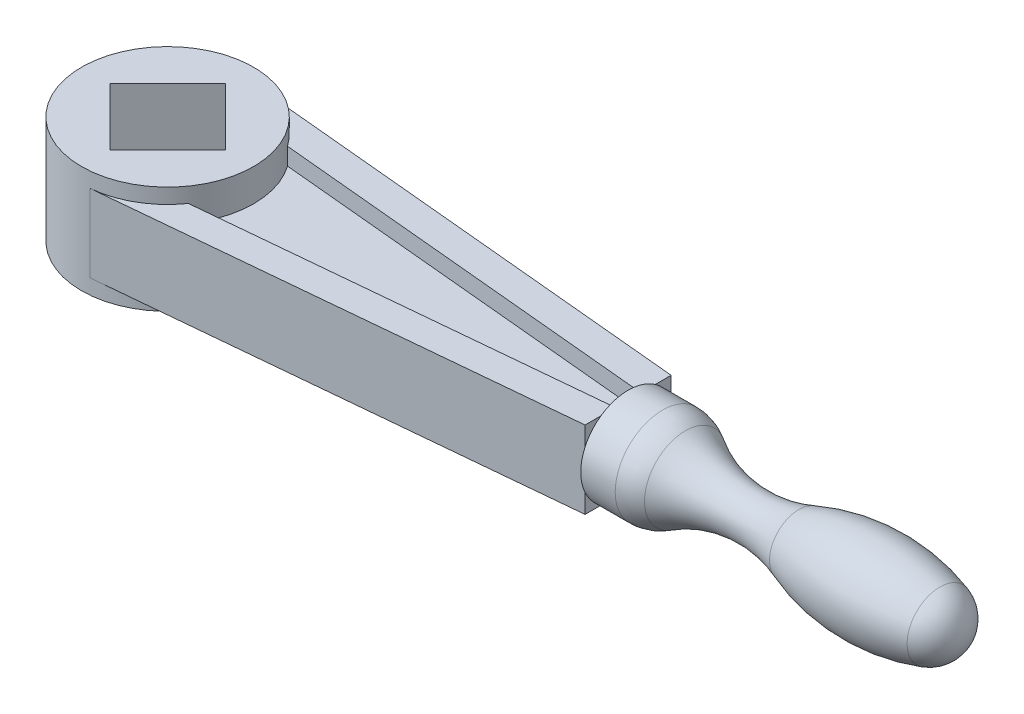
ISO-10303-21;
HEADER;
FILE_DESCRIPTION(('STEP AP214'),'2;1');
FILE_NAME('part.step','',(''),(''),'','','');
FILE_SCHEMA(('AUTOMOTIVE_DESIGN { 1 0 10303 214 1 1 1 1 }'));
ENDSEC;
DATA;
#1=APPLICATION_CONTEXT('core data for automotive mechanical design processes');
#2=APPLICATION_PROTOCOL_DEFINITION('international standard','automotive_design',2000,#1);
#3=PRODUCT_CONTEXT('',#1,'mechanical');
#4=PRODUCT('Part','Part','',(#3));
#5=PRODUCT_RELATED_PRODUCT_CATEGORY('part','',(#4));
#6=PRODUCT_DEFINITION_FORMATION('','',#4);
#7=PRODUCT_DEFINITION_CONTEXT('part definition',#1,'design');
#8=PRODUCT_DEFINITION('design','',#6,#7);
#9=PRODUCT_DEFINITION_SHAPE('','',#8);
#10=(LENGTH_UNIT() NAMED_UNIT(*) SI_UNIT(.MILLI.,.METRE.));
#11=(NAMED_UNIT(*) PLANE_ANGLE_UNIT() SI_UNIT($,.RADIAN.));
#12=(NAMED_UNIT(*) SI_UNIT($,.STERADIAN.) SOLID_ANGLE_UNIT());
#13=UNCERTAINTY_MEASURE_WITH_UNIT(LENGTH_MEASURE(1.E-05),#10,'distance_accuracy_value','');
#14=(GEOMETRIC_REPRESENTATION_CONTEXT(3) GLOBAL_UNCERTAINTY_ASSIGNED_CONTEXT((#13)) GLOBAL_UNIT_ASSIGNED_CONTEXT((#10,
#11,#12)) REPRESENTATION_CONTEXT('',''));
#15=CARTESIAN_POINT('',(0.,0.,0.));
#16=DIRECTION('',(0.,0.,1.));
#17=DIRECTION('',(1.,0.,0.));
#18=AXIS2_PLACEMENT_3D('',#15,#16,#17);
#19=CARTESIAN_POINT('',(107.,9.,0.));
#20=DIRECTION('',(-1.,0.,0.));
#21=DIRECTION('',(0.,0.,1.));
#22=AXIS2_PLACEMENT_3D('',#19,#20,#21);
#23=PLANE('',#22);
#24=DIRECTION('',(0.,-1.,0.));
#25=VECTOR('',#24,1.);
#26=CARTESIAN_POINT('',(107.,9.,10.));
#27=LINE('',#26,#25);
#28=CARTESIAN_POINT('',(107.,9.,10.));
#29=VERTEX_POINT('',#28);
#30=CARTESIAN_POINT('',(107.,4.58257569495584,10.));
#31=VERTEX_POINT('',#30);
#32=EDGE_CURVE('E215',#29,#31,#27,.T.);
#33=ORIENTED_EDGE('',*,*,#32,.T.);
#34=CARTESIAN_POINT('',(107.,0.,0.));
#35=DIRECTION('',(-1.,0.,0.));
#36=DIRECTION('',(0.,0.,1.));
#37=AXIS2_PLACEMENT_3D('',#34,#35,#36);
#38=CIRCLE('',#37,11.);
#39=CARTESIAN_POINT('',(107.,9.,6.32455532033676));
#40=VERTEX_POINT('',#39);
#41=EDGE_CURVE('E195',#31,#40,#38,.T.);
#42=ORIENTED_EDGE('',*,*,#41,.T.);
#43=DIRECTION('',(0.,0.,-1.));
#44=VECTOR('',#43,1.);
#45=CARTESIAN_POINT('',(107.,9.,0.));
#46=LINE('',#45,#44);
#47=EDGE_CURVE('E216',#29,#40,#46,.T.);
#48=ORIENTED_EDGE('',*,*,#47,.F.);
#49=EDGE_LOOP('',(#33,#42,#48));
#50=FACE_BOUND('',#49,.T.);
#51=ADVANCED_FACE('F50',(#50),#23,.F.);
#52=CARTESIAN_POINT('',(107.,9.,-6.32455532033676));
#53=VERTEX_POINT('',#52);
#54=CARTESIAN_POINT('',(107.,9.,-10.));
#55=VERTEX_POINT('',#54);
#56=EDGE_CURVE('E279',#53,#55,#46,.T.);
#57=ORIENTED_EDGE('',*,*,#56,.F.);
#58=CARTESIAN_POINT('',(107.,4.58257569495584,-10.));
#59=VERTEX_POINT('',#58);
#60=EDGE_CURVE('E11',#53,#59,#38,.T.);
#61=ORIENTED_EDGE('',*,*,#60,.T.);
#62=DIRECTION('',(0.,-1.,0.));
#63=VECTOR('',#62,1.);
#64=CARTESIAN_POINT('',(107.,9.,-10.));
#65=LINE('',#64,#63);
#66=EDGE_CURVE('E221',#55,#59,#65,.T.);
#67=ORIENTED_EDGE('',*,*,#66,.F.);
#68=EDGE_LOOP('',(#57,#61,#67));
#69=FACE_BOUND('',#68,.T.);
#70=ADVANCED_FACE('F379',(#69),#23,.F.);
#71=CARTESIAN_POINT('',(107.,-4.58257569495584,-10.));
#72=VERTEX_POINT('',#71);
#73=CARTESIAN_POINT('',(107.,-9.,-10.));
#74=VERTEX_POINT('',#73);
#75=EDGE_CURVE('E233',#72,#74,#65,.T.);
#76=ORIENTED_EDGE('',*,*,#75,.F.);
#77=CARTESIAN_POINT('',(107.,-9.,-6.32455532033676));
#78=VERTEX_POINT('',#77);
#79=EDGE_CURVE('E60',#72,#78,#38,.T.);
#80=ORIENTED_EDGE('',*,*,#79,.T.);
#81=DIRECTION('',(0.,0.,-1.));
#82=VECTOR('',#81,1.);
#83=CARTESIAN_POINT('',(107.,-9.,0.));
#84=LINE('',#83,#82);
#85=EDGE_CURVE('E264',#78,#74,#84,.T.);
#86=ORIENTED_EDGE('',*,*,#85,.T.);
#87=EDGE_LOOP('',(#76,#80,#86));
#88=FACE_BOUND('',#87,.T.);
#89=ADVANCED_FACE('F390',(#88),#23,.F.);
#90=CARTESIAN_POINT('',(0.,-9.,0.));
#91=DIRECTION('',(0.,1.,0.));
#92=DIRECTION('',(0.,0.,1.));
#93=AXIS2_PLACEMENT_3D('',#90,#91,#92);
#94=PLANE('',#93);
#95=CARTESIAN_POINT('',(0.,-9.,0.));
#96=DIRECTION('',(0.,1.,0.));
#97=DIRECTION('',(0.,0.,1.));
#98=AXIS2_PLACEMENT_3D('',#95,#96,#97);
#99=CIRCLE('',#98,20.);
#100=CARTESIAN_POINT('',(1.87741232719192,-9.,19.9116880990464));
#101=VERTEX_POINT('',#100);
#102=CARTESIAN_POINT('',(16.3518909317657,-9.,11.5158874150297));
#103=VERTEX_POINT('',#102);
#104=EDGE_CURVE('E266',#101,#103,#99,.T.);
#105=ORIENTED_EDGE('',*,*,#104,.T.);
#106=DIRECTION('',(0.995584404952322,0.,-0.0938706163595961));
#107=VECTOR('',#106,1.);
#108=CARTESIAN_POINT('',(107.,-9.,2.9689537469852));
#109=LINE('',#108,#107);
#110=CARTESIAN_POINT('',(107.,-9.,2.9689537469852));
#111=VERTEX_POINT('',#110);
#112=EDGE_CURVE('E334',#103,#111,#109,.T.);
#113=ORIENTED_EDGE('',*,*,#112,.T.);
#114=CARTESIAN_POINT('',(107.,-9.,6.32455532033676));
#115=VERTEX_POINT('',#114);
#116=EDGE_CURVE('E259',#115,#111,#84,.T.);
#117=ORIENTED_EDGE('',*,*,#116,.F.);
#118=CARTESIAN_POINT('',(107.,-9.,10.));
#119=VERTEX_POINT('',#118);
#120=EDGE_CURVE('E258',#119,#115,#84,.T.);
#121=ORIENTED_EDGE('',*,*,#120,.F.);
#122=DIRECTION('',(-0.995584404952322,0.,0.0938706163595961));
#123=VECTOR('',#122,1.);
#124=CARTESIAN_POINT('',(1.87741232719192,-9.,19.9116880990465));
#125=LINE('',#124,#123);
#126=EDGE_CURVE('E261',#119,#101,#125,.T.);
#127=ORIENTED_EDGE('',*,*,#126,.T.);
#128=EDGE_LOOP('',(#105,#113,#117,#121,#127));
#129=FACE_BOUND('',#128,.T.);
#130=ADVANCED_FACE('F396',(#129),#94,.F.);
#131=CARTESIAN_POINT('',(0.,9.,0.));
#132=DIRECTION('',(0.,1.,0.));
#133=DIRECTION('',(0.,0.,1.));
#134=AXIS2_PLACEMENT_3D('',#131,#132,#133);
#135=PLANE('',#134);
#136=DIRECTION('',(-0.995584404952322,0.,-0.0938706163595961));
#137=VECTOR('',#136,1.);
#138=CARTESIAN_POINT('',(107.,9.,-2.96895374698519));
#139=LINE('',#138,#137);
#140=CARTESIAN_POINT('',(107.,9.,-2.96895374698519));
#141=VERTEX_POINT('',#140);
#142=CARTESIAN_POINT('',(16.3518909317657,9.,-11.5158874150297));
#143=VERTEX_POINT('',#142);
#144=EDGE_CURVE('E303',#141,#143,#139,.T.);
#145=ORIENTED_EDGE('',*,*,#144,.F.);
#146=EDGE_CURVE('E273',#141,#53,#46,.T.);
#147=ORIENTED_EDGE('',*,*,#146,.T.);
#148=ORIENTED_EDGE('',*,*,#56,.T.);
#149=DIRECTION('',(-0.995584404952322,0.,-0.0938706163595961));
#150=VECTOR('',#149,1.);
#151=CARTESIAN_POINT('',(1.87741232719192,9.,-19.9116880990465));
#152=LINE('',#151,#150);
#153=CARTESIAN_POINT('',(1.87741232719192,9.,-19.9116880990465));
#154=VERTEX_POINT('',#153);
#155=EDGE_CURVE('E244',#55,#154,#152,.T.);
#156=ORIENTED_EDGE('',*,*,#155,.T.);
#157=CARTESIAN_POINT('',(0.,9.,0.));
#158=DIRECTION('',(0.,1.,0.));
#159=DIRECTION('',(0.,0.,1.));
#160=AXIS2_PLACEMENT_3D('',#157,#158,#159);
#161=CIRCLE('',#160,20.);
#162=EDGE_CURVE('E254',#143,#154,#161,.T.);
#163=ORIENTED_EDGE('',*,*,#162,.F.);
#164=EDGE_LOOP('',(#145,#147,#148,#156,#163));
#165=FACE_BOUND('',#164,.T.);
#166=ADVANCED_FACE('F403',(#165),#135,.T.);
#167=DIRECTION('',(0.995584404952322,0.,-0.0938706163595961));
#168=VECTOR('',#167,1.);
#169=CARTESIAN_POINT('',(107.,9.,2.9689537469852));
#170=LINE('',#169,#168);
#171=CARTESIAN_POINT('',(16.3518909317657,9.,11.5158874150297));
#172=VERTEX_POINT('',#171);
#173=CARTESIAN_POINT('',(107.,9.,2.9689537469852));
#174=VERTEX_POINT('',#173);
#175=EDGE_CURVE('E298',#172,#174,#170,.T.);
#176=ORIENTED_EDGE('',*,*,#175,.F.);
#177=CARTESIAN_POINT('',(1.87741232719192,9.,19.9116880990465));
#178=VERTEX_POINT('',#177);
#179=EDGE_CURVE('E276',#178,#172,#161,.T.);
#180=ORIENTED_EDGE('',*,*,#179,.F.);
#181=DIRECTION('',(-0.995584404952322,0.,0.0938706163595961));
#182=VECTOR('',#181,1.);
#183=CARTESIAN_POINT('',(1.87741232719192,9.,19.9116880990465));
#184=LINE('',#183,#182);
#185=EDGE_CURVE('E274',#29,#178,#184,.T.);
#186=ORIENTED_EDGE('',*,*,#185,.F.);
#187=ORIENTED_EDGE('',*,*,#47,.T.);
#188=EDGE_CURVE('E272',#40,#174,#46,.T.);
#189=ORIENTED_EDGE('',*,*,#188,.T.);
#190=EDGE_LOOP('',(#176,#180,#186,#187,#189));
#191=FACE_BOUND('',#190,.T.);
#192=ADVANCED_FACE('F429',(#191),#135,.T.);
#193=CARTESIAN_POINT('',(0.,12.5,0.));
#194=DIRECTION('',(0.,-1.,0.));
#195=DIRECTION('',(0.,0.,-1.));
#196=AXIS2_PLACEMENT_3D('',#193,#194,#195);
#197=CYLINDRICAL_SURFACE('',#196,20.);
#198=CARTESIAN_POINT('',(0.,-12.5,0.));
#199=DIRECTION('',(0.,1.,0.));
#200=DIRECTION('',(0.,0.,1.));
#201=AXIS2_PLACEMENT_3D('',#198,#199,#200);
#202=CIRCLE('',#201,20.);
#203=CARTESIAN_POINT('',(0.,-12.5,20.));
#204=VERTEX_POINT('',#203);
#205=EDGE_CURVE('E51',#204,#204,#202,.T.);
#206=ORIENTED_EDGE('',*,*,#205,.T.);
#207=EDGE_LOOP('',(#206));
#208=FACE_BOUND('',#207,.T.);
#209=CARTESIAN_POINT('',(0.,12.5,0.));
#210=DIRECTION('',(0.,1.,0.));
#211=DIRECTION('',(0.,0.,1.));
#212=AXIS2_PLACEMENT_3D('',#209,#210,#211);
#213=CIRCLE('',#212,20.);
#214=CARTESIAN_POINT('',(0.,12.5,20.));
#215=VERTEX_POINT('',#214);
#216=EDGE_CURVE('E457',#215,#215,#213,.T.);
#217=ORIENTED_EDGE('',*,*,#216,.F.);
#218=EDGE_LOOP('',(#217));
#219=FACE_BOUND('',#218,.T.);
#220=DIRECTION('',(0.,-1.,0.));
#221=VECTOR('',#220,1.);
#222=CARTESIAN_POINT('',(1.87741232719192,9.,19.9116880990465));
#223=LINE('',#222,#221);
#224=EDGE_CURVE('E74',#178,#101,#223,.T.);
#225=ORIENTED_EDGE('',*,*,#224,.F.);
#226=ORIENTED_EDGE('',*,*,#179,.T.);
#227=DIRECTION('',(0.,1.,0.));
#228=VECTOR('',#227,1.);
#229=CARTESIAN_POINT('',(16.3518909317657,5.,11.5158874150297));
#230=LINE('',#229,#228);
#231=CARTESIAN_POINT('',(16.3518909317657,5.,11.5158874150297));
#232=VERTEX_POINT('',#231);
#233=EDGE_CURVE('E286',#232,#172,#230,.T.);
#234=ORIENTED_EDGE('',*,*,#233,.F.);
#235=CARTESIAN_POINT('',(0.,5.,0.));
#236=DIRECTION('',(0.,-1.,0.));
#237=DIRECTION('',(0.,0.,1.));
#238=AXIS2_PLACEMENT_3D('',#235,#236,#237);
#239=CIRCLE('',#238,20.);
#240=CARTESIAN_POINT('',(16.3518909317657,5.,-11.5158874150297));
#241=VERTEX_POINT('',#240);
#242=EDGE_CURVE('E310',#241,#232,#239,.T.);
#243=ORIENTED_EDGE('',*,*,#242,.F.);
#244=DIRECTION('',(0.,1.,0.));
#245=VECTOR('',#244,1.);
#246=CARTESIAN_POINT('',(16.3518909317657,5.,-11.5158874150297));
#247=LINE('',#246,#245);
#248=EDGE_CURVE('E288',#241,#143,#247,.T.);
#249=ORIENTED_EDGE('',*,*,#248,.T.);
#250=ORIENTED_EDGE('',*,*,#162,.T.);
#251=DIRECTION('',(0.,-1.,0.));
#252=VECTOR('',#251,1.);
#253=CARTESIAN_POINT('',(1.87741232719192,9.,-19.9116880990465));
#254=LINE('',#253,#252);
#255=CARTESIAN_POINT('',(1.87741232719192,-9.,-19.9116880990465));
#256=VERTEX_POINT('',#255);
#257=EDGE_CURVE('E239',#154,#256,#254,.T.);
#258=ORIENTED_EDGE('',*,*,#257,.T.);
#259=CARTESIAN_POINT('',(16.3518909317657,-9.,-11.5158874150297));
#260=VERTEX_POINT('',#259);
#261=EDGE_CURVE('E267',#260,#256,#99,.T.);
#262=ORIENTED_EDGE('',*,*,#261,.F.);
#263=DIRECTION('',(0.,-1.,0.));
#264=VECTOR('',#263,1.);
#265=CARTESIAN_POINT('',(16.3518909317657,-5.,-11.5158874150297));
#266=LINE('',#265,#264);
#267=CARTESIAN_POINT('',(16.3518909317657,-5.,-11.5158874150297));
#268=VERTEX_POINT('',#267);
#269=EDGE_CURVE('E325',#268,#260,#266,.T.);
#270=ORIENTED_EDGE('',*,*,#269,.F.);
#271=CARTESIAN_POINT('',(0.,-5.,0.));
#272=DIRECTION('',(0.,-1.,0.));
#273=DIRECTION('',(0.,0.,1.));
#274=AXIS2_PLACEMENT_3D('',#271,#272,#273);
#275=CIRCLE('',#274,20.);
#276=CARTESIAN_POINT('',(16.3518909317657,-5.,11.5158874150297));
#277=VERTEX_POINT('',#276);
#278=EDGE_CURVE('E345',#268,#277,#275,.T.);
#279=ORIENTED_EDGE('',*,*,#278,.T.);
#280=DIRECTION('',(0.,-1.,0.));
#281=VECTOR('',#280,1.);
#282=CARTESIAN_POINT('',(16.3518909317657,-5.,11.5158874150297));
#283=LINE('',#282,#281);
#284=EDGE_CURVE('E324',#277,#103,#283,.T.);
#285=ORIENTED_EDGE('',*,*,#284,.T.);
#286=ORIENTED_EDGE('',*,*,#104,.F.);
#287=EDGE_LOOP('',(#225,#226,#234,#243,#249,#250,#258,#262,#270,#279,#285,#286));
#288=FACE_BOUND('',#287,.T.);
#289=ADVANCED_FACE('F47',(#208,#219,#288),#197,.T.);
#290=CARTESIAN_POINT('',(0.,12.5,0.));
#291=DIRECTION('',(0.,1.,0.));
#292=DIRECTION('',(0.,0.,1.));
#293=AXIS2_PLACEMENT_3D('',#290,#291,#292);
#294=PLANE('',#293);
#295=ORIENTED_EDGE('',*,*,#216,.T.);
#296=EDGE_LOOP('',(#295));
#297=FACE_BOUND('',#296,.T.);
#298=DIRECTION('',(-0.707106781186548,0.,-0.707106781186548));
#299=VECTOR('',#298,1.);
#300=CARTESIAN_POINT('',(0.,12.5,-13.4350288425444));
#301=LINE('',#300,#299);
#302=CARTESIAN_POINT('',(13.4350288425444,12.5,0.));
#303=VERTEX_POINT('',#302);
#304=CARTESIAN_POINT('',(0.,12.5,-13.4350288425444));
#305=VERTEX_POINT('',#304);
#306=EDGE_CURVE('E505',#303,#305,#301,.T.);
#307=ORIENTED_EDGE('',*,*,#306,.F.);
#308=DIRECTION('',(0.707106781186548,0.,-0.707106781186547));
#309=VECTOR('',#308,1.);
#310=CARTESIAN_POINT('',(13.4350288425444,12.5,0.));
#311=LINE('',#310,#309);
#312=CARTESIAN_POINT('',(0.,12.5,13.4350288425444));
#313=VERTEX_POINT('',#312);
#314=EDGE_CURVE('E482',#313,#303,#311,.T.);
#315=ORIENTED_EDGE('',*,*,#314,.F.);
#316=DIRECTION('',(0.707106781186548,0.,0.707106781186547));
#317=VECTOR('',#316,1.);
#318=CARTESIAN_POINT('',(-13.4350288425444,12.5,0.));
#319=LINE('',#318,#317);
#320=CARTESIAN_POINT('',(-13.4350288425444,12.5,0.));
#321=VERTEX_POINT('',#320);
#322=EDGE_CURVE('E479',#321,#313,#319,.T.);
#323=ORIENTED_EDGE('',*,*,#322,.F.);
#324=DIRECTION('',(-0.707106781186548,0.,0.707106781186548));
#325=VECTOR('',#324,1.);
#326=CARTESIAN_POINT('',(0.,12.5,-13.4350288425444));
#327=LINE('',#326,#325);
#328=EDGE_CURVE('E499',#305,#321,#327,.T.);
#329=ORIENTED_EDGE('',*,*,#328,.F.);
#330=EDGE_LOOP('',(#307,#315,#323,#329));
#331=FACE_BOUND('',#330,.T.);
#332=ADVANCED_FACE('F516',(#297,#331),#294,.T.);
#333=CARTESIAN_POINT('',(0.,-12.5,0.));
#334=DIRECTION('',(0.,1.,0.));
#335=DIRECTION('',(0.,0.,1.));
#336=AXIS2_PLACEMENT_3D('',#333,#334,#335);
#337=PLANE('',#336);
#338=ORIENTED_EDGE('',*,*,#205,.F.);
#339=EDGE_LOOP('',(#338));
#340=FACE_BOUND('',#339,.T.);
#341=DIRECTION('',(0.707106781186548,0.,-0.707106781186547));
#342=VECTOR('',#341,1.);
#343=CARTESIAN_POINT('',(13.4350288425444,-12.5,0.));
#344=LINE('',#343,#342);
#345=CARTESIAN_POINT('',(0.,-12.5,13.4350288425444));
#346=VERTEX_POINT('',#345);
#347=CARTESIAN_POINT('',(13.4350288425444,-12.5,0.));
#348=VERTEX_POINT('',#347);
#349=EDGE_CURVE('E219',#346,#348,#344,.T.);
#350=ORIENTED_EDGE('',*,*,#349,.T.);
#351=DIRECTION('',(-0.707106781186548,0.,-0.707106781186548));
#352=VECTOR('',#351,1.);
#353=CARTESIAN_POINT('',(0.,-12.5,-13.4350288425444));
#354=LINE('',#353,#352);
#355=CARTESIAN_POINT('',(0.,-12.5,-13.4350288425444));
#356=VERTEX_POINT('',#355);
#357=EDGE_CURVE('E487',#348,#356,#354,.T.);
#358=ORIENTED_EDGE('',*,*,#357,.T.);
#359=DIRECTION('',(-0.707106781186548,0.,0.707106781186548));
#360=VECTOR('',#359,1.);
#361=CARTESIAN_POINT('',(0.,-12.5,-13.4350288425444));
#362=LINE('',#361,#360);
#363=CARTESIAN_POINT('',(-13.4350288425444,-12.5,0.));
#364=VERTEX_POINT('',#363);
#365=EDGE_CURVE('E484',#356,#364,#362,.T.);
#366=ORIENTED_EDGE('',*,*,#365,.T.);
#367=DIRECTION('',(0.707106781186548,0.,0.707106781186547));
#368=VECTOR('',#367,1.);
#369=CARTESIAN_POINT('',(-13.4350288425444,-12.5,0.));
#370=LINE('',#369,#368);
#371=EDGE_CURVE('E477',#364,#346,#370,.T.);
#372=ORIENTED_EDGE('',*,*,#371,.T.);
#373=EDGE_LOOP('',(#350,#358,#366,#372));
#374=FACE_BOUND('',#373,.T.);
#375=ADVANCED_FACE('F525',(#340,#374),#337,.F.);
#376=CARTESIAN_POINT('',(13.4350288425444,12.5,0.));
#377=DIRECTION('',(-0.707106781186547,0.,-0.707106781186548));
#378=DIRECTION('',(-0.707106781186548,0.,0.707106781186547));
#379=AXIS2_PLACEMENT_3D('',#376,#377,#378);
#380=PLANE('',#379);
#381=ORIENTED_EDGE('',*,*,#349,.F.);
#382=DIRECTION('',(0.,-1.,0.));
#383=VECTOR('',#382,1.);
#384=CARTESIAN_POINT('',(0.,12.5,13.4350288425444));
#385=LINE('',#384,#383);
#386=EDGE_CURVE('E474',#313,#346,#385,.T.);
#387=ORIENTED_EDGE('',*,*,#386,.F.);
#388=ORIENTED_EDGE('',*,*,#314,.T.);
#389=DIRECTION('',(0.,-1.,0.));
#390=VECTOR('',#389,1.);
#391=CARTESIAN_POINT('',(13.4350288425444,12.5,0.));
#392=LINE('',#391,#390);
#393=EDGE_CURVE('E462',#303,#348,#392,.T.);
#394=ORIENTED_EDGE('',*,*,#393,.T.);
#395=EDGE_LOOP('',(#381,#387,#388,#394));
#396=FACE_BOUND('',#395,.T.);
#397=ADVANCED_FACE('F506',(#396),#380,.T.);
#398=CARTESIAN_POINT('',(0.,12.5,-13.4350288425444));
#399=DIRECTION('',(-0.707106781186548,0.,0.707106781186548));
#400=DIRECTION('',(0.707106781186548,0.,0.707106781186548));
#401=AXIS2_PLACEMENT_3D('',#398,#399,#400);
#402=PLANE('',#401);
#403=ORIENTED_EDGE('',*,*,#357,.F.);
#404=ORIENTED_EDGE('',*,*,#393,.F.);
#405=ORIENTED_EDGE('',*,*,#306,.T.);
#406=DIRECTION('',(0.,-1.,0.));
#407=VECTOR('',#406,1.);
#408=CARTESIAN_POINT('',(0.,12.5,-13.4350288425444));
#409=LINE('',#408,#407);
#410=EDGE_CURVE('E470',#305,#356,#409,.T.);
#411=ORIENTED_EDGE('',*,*,#410,.T.);
#412=EDGE_LOOP('',(#403,#404,#405,#411));
#413=FACE_BOUND('',#412,.T.);
#414=ADVANCED_FACE('F513',(#413),#402,.T.);
#415=CARTESIAN_POINT('',(0.,12.5,-13.4350288425444));
#416=DIRECTION('',(0.707106781186548,0.,0.707106781186548));
#417=DIRECTION('',(0.707106781186548,0.,-0.707106781186548));
#418=AXIS2_PLACEMENT_3D('',#415,#416,#417);
#419=PLANE('',#418);
#420=ORIENTED_EDGE('',*,*,#365,.F.);
#421=ORIENTED_EDGE('',*,*,#410,.F.);
#422=ORIENTED_EDGE('',*,*,#328,.T.);
#423=DIRECTION('',(0.,-1.,0.));
#424=VECTOR('',#423,1.);
#425=CARTESIAN_POINT('',(-13.4350288425444,12.5,0.));
#426=LINE('',#425,#424);
#427=EDGE_CURVE('E472',#321,#364,#426,.T.);
#428=ORIENTED_EDGE('',*,*,#427,.T.);
#429=EDGE_LOOP('',(#420,#421,#422,#428));
#430=FACE_BOUND('',#429,.T.);
#431=ADVANCED_FACE('F523',(#430),#419,.T.);
#432=CARTESIAN_POINT('',(-13.4350288425444,12.5,0.));
#433=DIRECTION('',(0.707106781186547,0.,-0.707106781186548));
#434=DIRECTION('',(-0.707106781186548,0.,-0.707106781186547));
#435=AXIS2_PLACEMENT_3D('',#432,#433,#434);
#436=PLANE('',#435);
#437=ORIENTED_EDGE('',*,*,#371,.F.);
#438=ORIENTED_EDGE('',*,*,#427,.F.);
#439=ORIENTED_EDGE('',*,*,#322,.T.);
#440=ORIENTED_EDGE('',*,*,#386,.T.);
#441=EDGE_LOOP('',(#437,#438,#439,#440));
#442=FACE_BOUND('',#441,.T.);
#443=ADVANCED_FACE('F397',(#442),#436,.T.);
#444=CARTESIAN_POINT('',(1.87741232719192,9.,19.9116880990465));
#445=DIRECTION('',(0.0938706163595961,0.,0.995584404952322));
#446=DIRECTION('',(0.995584404952322,0.,-0.0938706163595961));
#447=AXIS2_PLACEMENT_3D('',#444,#445,#446);
#448=PLANE('',#447);
#449=ORIENTED_EDGE('',*,*,#126,.F.);
#450=CARTESIAN_POINT('',(107.,-4.58257569495584,10.));
#451=VERTEX_POINT('',#450);
#452=EDGE_CURVE('E213',#451,#119,#27,.T.);
#453=ORIENTED_EDGE('',*,*,#452,.F.);
#454=EDGE_CURVE('E187',#31,#451,#27,.T.);
#455=ORIENTED_EDGE('',*,*,#454,.F.);
#456=ORIENTED_EDGE('',*,*,#32,.F.);
#457=ORIENTED_EDGE('',*,*,#185,.T.);
#458=ORIENTED_EDGE('',*,*,#224,.T.);
#459=EDGE_LOOP('',(#449,#453,#455,#456,#457,#458));
#460=FACE_BOUND('',#459,.T.);
#461=ADVANCED_FACE('F209',(#460),#448,.T.);
#462=ORIENTED_EDGE('',*,*,#120,.T.);
#463=EDGE_CURVE('E206',#115,#451,#38,.T.);
#464=ORIENTED_EDGE('',*,*,#463,.T.);
#465=ORIENTED_EDGE('',*,*,#452,.T.);
#466=EDGE_LOOP('',(#462,#464,#465));
#467=FACE_BOUND('',#466,.T.);
#468=ADVANCED_FACE('F385',(#467),#23,.F.);
#469=CARTESIAN_POINT('',(1.87741232719192,9.,-19.9116880990465));
#470=DIRECTION('',(-0.0938706163595961,0.,0.995584404952322));
#471=DIRECTION('',(0.995584404952322,0.,0.0938706163595961));
#472=AXIS2_PLACEMENT_3D('',#469,#470,#471);
#473=PLANE('',#472);
#474=DIRECTION('',(-0.995584404952322,0.,-0.0938706163595961));
#475=VECTOR('',#474,1.);
#476=CARTESIAN_POINT('',(1.87741232719192,-9.,-19.9116880990465));
#477=LINE('',#476,#475);
#478=EDGE_CURVE('E252',#74,#256,#477,.T.);
#479=ORIENTED_EDGE('',*,*,#478,.T.);
#480=ORIENTED_EDGE('',*,*,#257,.F.);
#481=ORIENTED_EDGE('',*,*,#155,.F.);
#482=ORIENTED_EDGE('',*,*,#66,.T.);
#483=EDGE_CURVE('E229',#59,#72,#65,.T.);
#484=ORIENTED_EDGE('',*,*,#483,.T.);
#485=ORIENTED_EDGE('',*,*,#75,.T.);
#486=EDGE_LOOP('',(#479,#480,#481,#482,#484,#485));
#487=FACE_BOUND('',#486,.T.);
#488=ADVANCED_FACE('F395',(#487),#473,.F.);
#489=CARTESIAN_POINT('',(107.,-9.,-2.96895374698519));
#490=VERTEX_POINT('',#489);
#491=EDGE_CURVE('E257',#490,#78,#84,.T.);
#492=ORIENTED_EDGE('',*,*,#491,.F.);
#493=DIRECTION('',(-0.995584404952322,0.,-0.0938706163595961));
#494=VECTOR('',#493,1.);
#495=CARTESIAN_POINT('',(107.,-9.,-2.96895374698519));
#496=LINE('',#495,#494);
#497=EDGE_CURVE('E202',#490,#260,#496,.T.);
#498=ORIENTED_EDGE('',*,*,#497,.T.);
#499=ORIENTED_EDGE('',*,*,#261,.T.);
#500=ORIENTED_EDGE('',*,*,#478,.F.);
#501=ORIENTED_EDGE('',*,*,#85,.F.);
#502=EDGE_LOOP('',(#492,#498,#499,#500,#501));
#503=FACE_BOUND('',#502,.T.);
#504=ADVANCED_FACE('F399',(#503),#94,.F.);
#505=CARTESIAN_POINT('',(107.,5.,2.9689537469852));
#506=DIRECTION('',(0.0938706163595961,0.,0.995584404952322));
#507=DIRECTION('',(0.995584404952322,0.,-0.0938706163595961));
#508=AXIS2_PLACEMENT_3D('',#505,#506,#507);
#509=PLANE('',#508);
#510=ORIENTED_EDGE('',*,*,#175,.T.);
#511=DIRECTION('',(0.,1.,0.));
#512=VECTOR('',#511,1.);
#513=CARTESIAN_POINT('',(107.,5.,2.9689537469852));
#514=LINE('',#513,#512);
#515=CARTESIAN_POINT('',(107.,5.,2.9689537469852));
#516=VERTEX_POINT('',#515);
#517=EDGE_CURVE('E291',#516,#174,#514,.T.);
#518=ORIENTED_EDGE('',*,*,#517,.F.);
#519=DIRECTION('',(0.995584404952322,0.,-0.0938706163595961));
#520=VECTOR('',#519,1.);
#521=CARTESIAN_POINT('',(107.,5.,2.9689537469852));
#522=LINE('',#521,#520);
#523=EDGE_CURVE('E289',#232,#516,#522,.T.);
#524=ORIENTED_EDGE('',*,*,#523,.F.);
#525=ORIENTED_EDGE('',*,*,#233,.T.);
#526=EDGE_LOOP('',(#510,#518,#524,#525));
#527=FACE_BOUND('',#526,.T.);
#528=ADVANCED_FACE('F433',(#527),#509,.F.);
#529=CARTESIAN_POINT('',(107.,5.,-2.96895374698519));
#530=DIRECTION('',(0.0938706163595961,0.,-0.995584404952322));
#531=DIRECTION('',(-0.995584404952322,0.,-0.0938706163595961));
#532=AXIS2_PLACEMENT_3D('',#529,#530,#531);
#533=PLANE('',#532);
#534=ORIENTED_EDGE('',*,*,#144,.T.);
#535=ORIENTED_EDGE('',*,*,#248,.F.);
#536=DIRECTION('',(-0.995584404952322,0.,-0.0938706163595961));
#537=VECTOR('',#536,1.);
#538=CARTESIAN_POINT('',(107.,5.,-2.96895374698519));
#539=LINE('',#538,#537);
#540=CARTESIAN_POINT('',(107.,5.,-2.96895374698519));
#541=VERTEX_POINT('',#540);
#542=EDGE_CURVE('E311',#541,#241,#539,.T.);
#543=ORIENTED_EDGE('',*,*,#542,.F.);
#544=DIRECTION('',(0.,1.,0.));
#545=VECTOR('',#544,1.);
#546=CARTESIAN_POINT('',(107.,5.,-2.96895374698519));
#547=LINE('',#546,#545);
#548=EDGE_CURVE('E285',#541,#141,#547,.T.);
#549=ORIENTED_EDGE('',*,*,#548,.T.);
#550=EDGE_LOOP('',(#534,#535,#543,#549));
#551=FACE_BOUND('',#550,.T.);
#552=ADVANCED_FACE('F439',(#551),#533,.F.);
#553=CARTESIAN_POINT('',(0.,5.,0.));
#554=DIRECTION('',(0.,1.,0.));
#555=DIRECTION('',(0.,0.,1.));
#556=AXIS2_PLACEMENT_3D('',#553,#554,#555);
#557=PLANE('',#556);
#558=DIRECTION('',(0.,0.,-1.));
#559=VECTOR('',#558,1.);
#560=CARTESIAN_POINT('',(107.,5.,2.9689537469852));
#561=LINE('',#560,#559);
#562=EDGE_CURVE('E299',#516,#541,#561,.T.);
#563=ORIENTED_EDGE('',*,*,#562,.T.);
#564=ORIENTED_EDGE('',*,*,#542,.T.);
#565=ORIENTED_EDGE('',*,*,#242,.T.);
#566=ORIENTED_EDGE('',*,*,#523,.T.);
#567=EDGE_LOOP('',(#563,#564,#565,#566));
#568=FACE_BOUND('',#567,.T.);
#569=ADVANCED_FACE('F440',(#568),#557,.T.);
#570=CARTESIAN_POINT('',(107.,-5.,-2.96895374698519));
#571=DIRECTION('',(-0.0938706163595961,0.,0.995584404952322));
#572=DIRECTION('',(0.995584404952322,0.,0.0938706163595961));
#573=AXIS2_PLACEMENT_3D('',#570,#571,#572);
#574=PLANE('',#573);
#575=ORIENTED_EDGE('',*,*,#497,.F.);
#576=DIRECTION('',(0.,-1.,0.));
#577=VECTOR('',#576,1.);
#578=CARTESIAN_POINT('',(107.,-5.,-2.96895374698519));
#579=LINE('',#578,#577);
#580=CARTESIAN_POINT('',(107.,-5.,-2.96895374698519));
#581=VERTEX_POINT('',#580);
#582=EDGE_CURVE('E301',#581,#490,#579,.T.);
#583=ORIENTED_EDGE('',*,*,#582,.F.);
#584=DIRECTION('',(-0.995584404952322,0.,-0.0938706163595961));
#585=VECTOR('',#584,1.);
#586=CARTESIAN_POINT('',(107.,-5.,-2.96895374698519));
#587=LINE('',#586,#585);
#588=EDGE_CURVE('E350',#581,#268,#587,.T.);
#589=ORIENTED_EDGE('',*,*,#588,.T.);
#590=ORIENTED_EDGE('',*,*,#269,.T.);
#591=EDGE_LOOP('',(#575,#583,#589,#590));
#592=FACE_BOUND('',#591,.T.);
#593=ADVANCED_FACE('F565',(#592),#574,.T.);
#594=CARTESIAN_POINT('',(107.,-5.,2.9689537469852));
#595=DIRECTION('',(-0.0938706163595961,0.,-0.995584404952322));
#596=DIRECTION('',(-0.995584404952322,0.,0.0938706163595961));
#597=AXIS2_PLACEMENT_3D('',#594,#595,#596);
#598=PLANE('',#597);
#599=ORIENTED_EDGE('',*,*,#112,.F.);
#600=ORIENTED_EDGE('',*,*,#284,.F.);
#601=DIRECTION('',(0.995584404952322,0.,-0.0938706163595961));
#602=VECTOR('',#601,1.);
#603=CARTESIAN_POINT('',(107.,-5.,2.9689537469852));
#604=LINE('',#603,#602);
#605=CARTESIAN_POINT('',(107.,-5.,2.9689537469852));
#606=VERTEX_POINT('',#605);
#607=EDGE_CURVE('E335',#277,#606,#604,.T.);
#608=ORIENTED_EDGE('',*,*,#607,.T.);
#609=DIRECTION('',(0.,-1.,0.));
#610=VECTOR('',#609,1.);
#611=CARTESIAN_POINT('',(107.,-5.,2.9689537469852));
#612=LINE('',#611,#610);
#613=EDGE_CURVE('E327',#606,#111,#612,.T.);
#614=ORIENTED_EDGE('',*,*,#613,.T.);
#615=EDGE_LOOP('',(#599,#600,#608,#614));
#616=FACE_BOUND('',#615,.T.);
#617=ADVANCED_FACE('F570',(#616),#598,.T.);
#618=CARTESIAN_POINT('',(0.,-5.,0.));
#619=DIRECTION('',(0.,1.,0.));
#620=DIRECTION('',(0.,0.,1.));
#621=AXIS2_PLACEMENT_3D('',#618,#619,#620);
#622=PLANE('',#621);
#623=DIRECTION('',(0.,0.,-1.));
#624=VECTOR('',#623,1.);
#625=CARTESIAN_POINT('',(107.,-5.,2.9689537469852));
#626=LINE('',#625,#624);
#627=EDGE_CURVE('E340',#606,#581,#626,.T.);
#628=ORIENTED_EDGE('',*,*,#627,.F.);
#629=ORIENTED_EDGE('',*,*,#607,.F.);
#630=ORIENTED_EDGE('',*,*,#278,.F.);
#631=ORIENTED_EDGE('',*,*,#588,.F.);
#632=EDGE_LOOP('',(#628,#629,#630,#631));
#633=FACE_BOUND('',#632,.T.);
#634=ADVANCED_FACE('F573',(#633),#622,.F.);
#635=CARTESIAN_POINT('',(107.,0.,0.));
#636=DIRECTION('',(1.,0.,0.));
#637=DIRECTION('',(0.,0.,-1.));
#638=AXIS2_PLACEMENT_3D('',#635,#636,#637);
#639=PLANE('',#638);
#640=ORIENTED_EDGE('',*,*,#483,.F.);
#641=EDGE_CURVE('E411',#59,#72,#38,.T.);
#642=ORIENTED_EDGE('',*,*,#641,.T.);
#643=EDGE_LOOP('',(#640,#642));
#644=FACE_BOUND('',#643,.T.);
#645=ADVANCED_FACE('F415',(#644),#639,.F.);
#646=EDGE_CURVE('E68',#451,#31,#38,.T.);
#647=ORIENTED_EDGE('',*,*,#646,.T.);
#648=ORIENTED_EDGE('',*,*,#454,.T.);
#649=EDGE_LOOP('',(#647,#648));
#650=FACE_BOUND('',#649,.T.);
#651=ADVANCED_FACE('F190',(#650),#639,.F.);
#652=ORIENTED_EDGE('',*,*,#582,.T.);
#653=ORIENTED_EDGE('',*,*,#491,.T.);
#654=EDGE_CURVE('E194',#78,#115,#38,.T.);
#655=ORIENTED_EDGE('',*,*,#654,.T.);
#656=ORIENTED_EDGE('',*,*,#116,.T.);
#657=ORIENTED_EDGE('',*,*,#613,.F.);
#658=ORIENTED_EDGE('',*,*,#627,.T.);
#659=EDGE_LOOP('',(#652,#653,#655,#656,#657,#658));
#660=FACE_BOUND('',#659,.T.);
#661=ADVANCED_FACE('F454',(#660),#639,.F.);
#662=ORIENTED_EDGE('',*,*,#146,.F.);
#663=ORIENTED_EDGE('',*,*,#548,.F.);
#664=ORIENTED_EDGE('',*,*,#562,.F.);
#665=ORIENTED_EDGE('',*,*,#517,.T.);
#666=ORIENTED_EDGE('',*,*,#188,.F.);
#667=EDGE_CURVE('E56',#40,#53,#38,.T.);
#668=ORIENTED_EDGE('',*,*,#667,.T.);
#669=EDGE_LOOP('',(#662,#663,#664,#665,#666,#668));
#670=FACE_BOUND('',#669,.T.);
#671=ADVANCED_FACE('F578',(#670),#639,.F.);
#672=CARTESIAN_POINT('',(0.,0.,0.));
#673=DIRECTION('',(-1.,0.,0.));
#674=DIRECTION('',(0.,0.,1.));
#675=AXIS2_PLACEMENT_3D('',#672,#673,#674);
#676=CYLINDRICAL_SURFACE('',#675,11.);
#677=ORIENTED_EDGE('',*,*,#41,.F.);
#678=ORIENTED_EDGE('',*,*,#646,.F.);
#679=ORIENTED_EDGE('',*,*,#463,.F.);
#680=ORIENTED_EDGE('',*,*,#654,.F.);
#681=ORIENTED_EDGE('',*,*,#79,.F.);
#682=ORIENTED_EDGE('',*,*,#641,.F.);
#683=ORIENTED_EDGE('',*,*,#60,.F.);
#684=ORIENTED_EDGE('',*,*,#667,.F.);
#685=EDGE_LOOP('',(#677,#678,#679,#680,#681,#682,#683,#684));
#686=FACE_BOUND('',#685,.T.);
#687=CARTESIAN_POINT('',(115.,0.,0.));
#688=DIRECTION('',(-1.,0.,0.));
#689=DIRECTION('',(0.,0.,1.));
#690=AXIS2_PLACEMENT_3D('',#687,#688,#689);
#691=CIRCLE('',#690,11.);
#692=CARTESIAN_POINT('',(115.,0.,11.));
#693=VERTEX_POINT('',#692);
#694=EDGE_CURVE('E192',#693,#693,#691,.T.);
#695=ORIENTED_EDGE('',*,*,#694,.T.);
#696=EDGE_LOOP('',(#695));
#697=FACE_BOUND('',#696,.T.);
#698=ADVANCED_FACE('F197',(#686,#697),#676,.T.);
#699=CARTESIAN_POINT('',(115.,0.,0.));
#700=DIRECTION('',(-1.,0.,0.));
#701=DIRECTION('',(0.,0.,1.));
#702=AXIS2_PLACEMENT_3D('',#699,#700,#701);
#703=DEGENERATE_TOROIDAL_SURFACE('',#702,0.999999999999999,10.,.T.);
#704=ORIENTED_EDGE('',*,*,#694,.F.);
#705=EDGE_LOOP('',(#704));
#706=FACE_BOUND('',#705,.T.);
#707=CARTESIAN_POINT('',(120.294389015942,0.,0.));
#708=DIRECTION('',(-1.,0.,0.));
#709=DIRECTION('',(0.,0.,1.));
#710=AXIS2_PLACEMENT_3D('',#707,#708,#709);
#711=CIRCLE('',#710,9.48348070946534);
#712=CARTESIAN_POINT('',(120.294389015942,0.,9.48348070946534));
#713=VERTEX_POINT('',#712);
#714=EDGE_CURVE('E354',#713,#713,#711,.T.);
#715=ORIENTED_EDGE('',*,*,#714,.T.);
#716=EDGE_LOOP('',(#715));
#717=FACE_BOUND('',#716,.T.);
#718=ADVANCED_FACE('F583',(#706,#717),#703,.T.);
#719=CARTESIAN_POINT('',(136.177556063769,0.,0.));
#720=DIRECTION('',(-1.,0.,0.));
#721=DIRECTION('',(0.,0.,1.));
#722=AXIS2_PLACEMENT_3D('',#719,#720,#721);
#723=TOROIDAL_SURFACE('',#722,34.9339228378614,30.);
#724=ORIENTED_EDGE('',*,*,#714,.F.);
#725=EDGE_LOOP('',(#724));
#726=FACE_BOUND('',#725,.T.);
#727=CARTESIAN_POINT('',(146.683629361781,0.,0.));
#728=DIRECTION('',(-1.,0.,0.));
#729=DIRECTION('',(0.,0.,1.));
#730=AXIS2_PLACEMENT_3D('',#727,#728,#729);
#731=CIRCLE('',#730,6.83370177366336);
#732=CARTESIAN_POINT('',(146.683629361781,0.,6.83370177366336));
#733=VERTEX_POINT('',#732);
#734=EDGE_CURVE('E360',#733,#733,#731,.T.);
#735=ORIENTED_EDGE('',*,*,#734,.T.);
#736=EDGE_LOOP('',(#735));
#737=FACE_BOUND('',#736,.T.);
#738=ADVANCED_FACE('F376',(#726,#737),#723,.F.);
#739=CARTESIAN_POINT('',(164.193751525134,0.,0.));
#740=DIRECTION('',(-1.,0.,0.));
#741=DIRECTION('',(0.,0.,1.));
#742=AXIS2_PLACEMENT_3D('',#739,#740,#741);
#743=DEGENERATE_TOROIDAL_SURFACE('',#742,40.,50.,.F.);
#744=ORIENTED_EDGE('',*,*,#734,.F.);
#745=EDGE_LOOP('',(#744));
#746=FACE_BOUND('',#745,.T.);
#747=CARTESIAN_POINT('',(179.439285423784,0.,0.));
#748=DIRECTION('',(-1.,0.,0.));
#749=DIRECTION('',(0.,0.,1.));
#750=AXIS2_PLACEMENT_3D('',#747,#748,#749);
#751=CIRCLE('',#750,7.61904761904762);
#752=CARTESIAN_POINT('',(179.439285423784,0.,7.61904761904762));
#753=VERTEX_POINT('',#752);
#754=EDGE_CURVE('E361',#753,#753,#751,.T.);
#755=ORIENTED_EDGE('',*,*,#754,.T.);
#756=EDGE_LOOP('',(#755));
#757=FACE_BOUND('',#756,.T.);
#758=ADVANCED_FACE('F366',(#746,#757),#743,.F.);
#759=CARTESIAN_POINT('',(177.,0.,0.));
#760=DIRECTION('',(-1.,0.,0.));
#761=DIRECTION('',(0.,0.,-1.));
#762=AXIS2_PLACEMENT_3D('',#759,#760,#761);
#763=SPHERICAL_SURFACE('',#762,8.00000000000001);
#764=ORIENTED_EDGE('',*,*,#754,.F.);
#765=EDGE_LOOP('',(#764));
#766=FACE_BOUND('',#765,.T.);
#767=ADVANCED_FACE('F367',(#766),#763,.T.);
#768=CLOSED_SHELL('',(#51,#70,#89,#130,#166,#192,#289,#332,#375,#397,#414,#431,#443,#461,#468,
#488,#504,#528,#552,#569,#593,#617,#634,#645,#651,#661,#671,#698,#718,#738,#758,#767));
#769=MANIFOLD_SOLID_BREP('B2',#768);
#770=ADVANCED_BREP_SHAPE_REPRESENTATION('',(#18,#769),#14);
#771=SHAPE_DEFINITION_REPRESENTATION(#9,#770);
ENDSEC;
END-ISO-10303-21;
